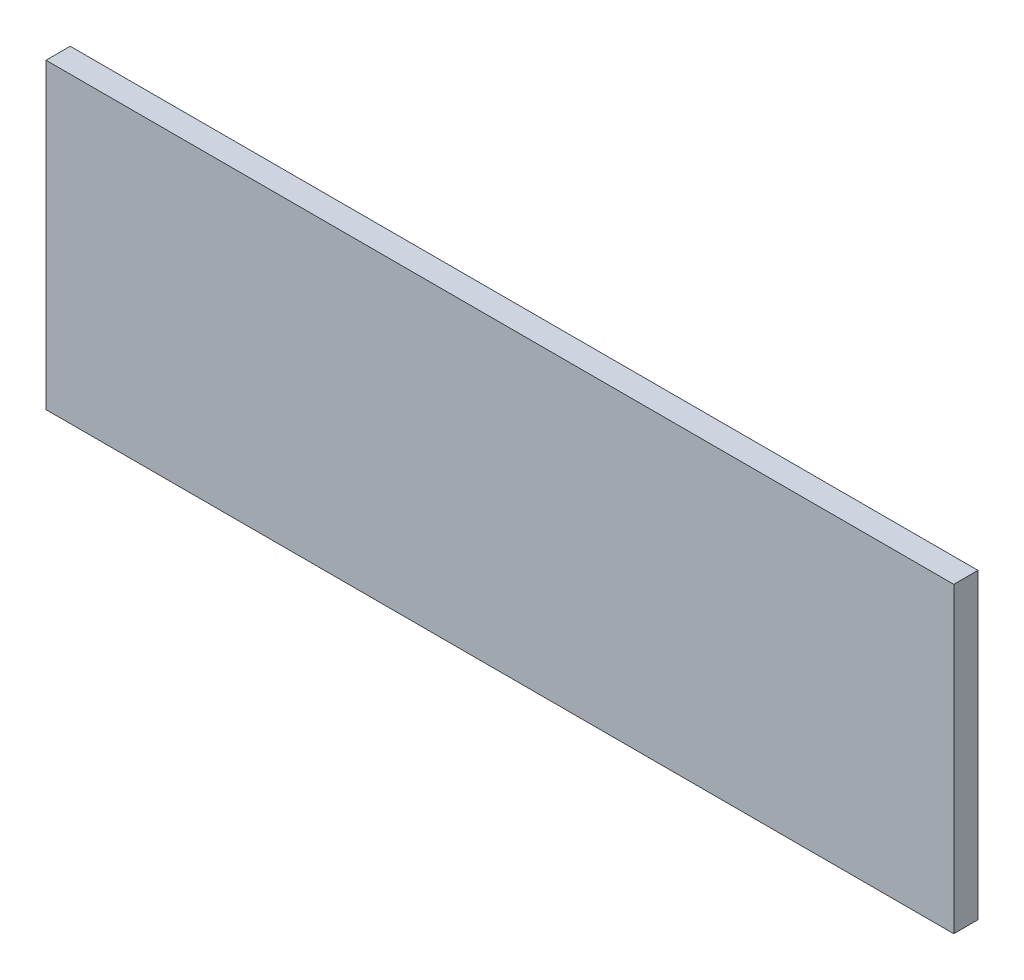
ISO-10303-21;
HEADER;
FILE_DESCRIPTION(('STEP AP214'),'2;1');
FILE_NAME('part.step','',(''),(''),'','','');
FILE_SCHEMA(('AUTOMOTIVE_DESIGN { 1 0 10303 214 1 1 1 1 }'));
ENDSEC;
DATA;
#1=APPLICATION_CONTEXT('core data for automotive mechanical design processes');
#2=APPLICATION_PROTOCOL_DEFINITION('international standard','automotive_design',2000,#1);
#3=PRODUCT_CONTEXT('',#1,'mechanical');
#4=PRODUCT('Part','Part','',(#3));
#5=PRODUCT_RELATED_PRODUCT_CATEGORY('part','',(#4));
#6=PRODUCT_DEFINITION_FORMATION('','',#4);
#7=PRODUCT_DEFINITION_CONTEXT('part definition',#1,'design');
#8=PRODUCT_DEFINITION('design','',#6,#7);
#9=PRODUCT_DEFINITION_SHAPE('','',#8);
#10=(LENGTH_UNIT() NAMED_UNIT(*) SI_UNIT(.MILLI.,.METRE.));
#11=(NAMED_UNIT(*) PLANE_ANGLE_UNIT() SI_UNIT($,.RADIAN.));
#12=(NAMED_UNIT(*) SI_UNIT($,.STERADIAN.) SOLID_ANGLE_UNIT());
#13=UNCERTAINTY_MEASURE_WITH_UNIT(LENGTH_MEASURE(1.E-05),#10,'distance_accuracy_value','');
#14=(GEOMETRIC_REPRESENTATION_CONTEXT(3) GLOBAL_UNCERTAINTY_ASSIGNED_CONTEXT((#13)) GLOBAL_UNIT_ASSIGNED_CONTEXT((#10,
#11,#12)) REPRESENTATION_CONTEXT('',''));
#15=CARTESIAN_POINT('',(0.,0.,0.));
#16=DIRECTION('',(0.,0.,1.));
#17=DIRECTION('',(1.,0.,0.));
#18=AXIS2_PLACEMENT_3D('',#15,#16,#17);
#19=CARTESIAN_POINT('',(75.,-25.,-2.));
#20=DIRECTION('',(0.,0.,1.));
#21=DIRECTION('',(1.,0.,0.));
#22=AXIS2_PLACEMENT_3D('',#19,#20,#21);
#23=PLANE('',#22);
#24=DIRECTION('',(0.,1.,0.));
#25=VECTOR('',#24,1.);
#26=CARTESIAN_POINT('',(-75.,-25.,-2.));
#27=LINE('',#26,#25);
#28=CARTESIAN_POINT('',(-75.,-25.,-2.));
#29=VERTEX_POINT('',#28);
#30=CARTESIAN_POINT('',(-75.,25.,-2.));
#31=VERTEX_POINT('',#30);
#32=EDGE_CURVE('E112',#29,#31,#27,.T.);
#33=ORIENTED_EDGE('',*,*,#32,.T.);
#34=DIRECTION('',(-1.,0.,0.));
#35=VECTOR('',#34,1.);
#36=CARTESIAN_POINT('',(75.,25.,-2.));
#37=LINE('',#36,#35);
#38=CARTESIAN_POINT('',(75.,25.,-2.));
#39=VERTEX_POINT('',#38);
#40=EDGE_CURVE('E11',#39,#31,#37,.T.);
#41=ORIENTED_EDGE('',*,*,#40,.F.);
#42=DIRECTION('',(0.,1.,0.));
#43=VECTOR('',#42,1.);
#44=CARTESIAN_POINT('',(75.,-25.,-2.));
#45=LINE('',#44,#43);
#46=CARTESIAN_POINT('',(75.,-25.,-2.));
#47=VERTEX_POINT('',#46);
#48=EDGE_CURVE('E97',#47,#39,#45,.T.);
#49=ORIENTED_EDGE('',*,*,#48,.F.);
#50=DIRECTION('',(-1.,0.,0.));
#51=VECTOR('',#50,1.);
#52=CARTESIAN_POINT('',(75.,-25.,-2.));
#53=LINE('',#52,#51);
#54=EDGE_CURVE('E108',#47,#29,#53,.T.);
#55=ORIENTED_EDGE('',*,*,#54,.T.);
#56=EDGE_LOOP('',(#33,#41,#49,#55));
#57=FACE_BOUND('',#56,.T.);
#58=ADVANCED_FACE('F39',(#57),#23,.F.);
#59=CARTESIAN_POINT('',(75.,25.,2.));
#60=DIRECTION('',(0.,-1.,0.));
#61=DIRECTION('',(0.,0.,-1.));
#62=AXIS2_PLACEMENT_3D('',#59,#60,#61);
#63=PLANE('',#62);
#64=DIRECTION('',(0.,0.,1.));
#65=VECTOR('',#64,1.);
#66=CARTESIAN_POINT('',(-75.,25.,2.));
#67=LINE('',#66,#65);
#68=CARTESIAN_POINT('',(-75.,25.,2.));
#69=VERTEX_POINT('',#68);
#70=EDGE_CURVE('E102',#31,#69,#67,.T.);
#71=ORIENTED_EDGE('',*,*,#70,.T.);
#72=DIRECTION('',(-1.,0.,0.));
#73=VECTOR('',#72,1.);
#74=CARTESIAN_POINT('',(75.,25.,2.));
#75=LINE('',#74,#73);
#76=CARTESIAN_POINT('',(75.,25.,2.));
#77=VERTEX_POINT('',#76);
#78=EDGE_CURVE('E48',#77,#69,#75,.T.);
#79=ORIENTED_EDGE('',*,*,#78,.F.);
#80=DIRECTION('',(0.,0.,1.));
#81=VECTOR('',#80,1.);
#82=CARTESIAN_POINT('',(75.,25.,2.));
#83=LINE('',#82,#81);
#84=EDGE_CURVE('E92',#39,#77,#83,.T.);
#85=ORIENTED_EDGE('',*,*,#84,.F.);
#86=ORIENTED_EDGE('',*,*,#40,.T.);
#87=EDGE_LOOP('',(#71,#79,#85,#86));
#88=FACE_BOUND('',#87,.T.);
#89=ADVANCED_FACE('F101',(#88),#63,.F.);
#90=CARTESIAN_POINT('',(75.,-25.,2.));
#91=DIRECTION('',(0.,0.,-1.));
#92=DIRECTION('',(-1.,0.,0.));
#93=AXIS2_PLACEMENT_3D('',#90,#91,#92);
#94=PLANE('',#93);
#95=DIRECTION('',(0.,-1.,0.));
#96=VECTOR('',#95,1.);
#97=CARTESIAN_POINT('',(-75.,-25.,2.));
#98=LINE('',#97,#96);
#99=CARTESIAN_POINT('',(-75.,-25.,2.));
#100=VERTEX_POINT('',#99);
#101=EDGE_CURVE('E78',#69,#100,#98,.T.);
#102=ORIENTED_EDGE('',*,*,#101,.T.);
#103=DIRECTION('',(-1.,0.,0.));
#104=VECTOR('',#103,1.);
#105=CARTESIAN_POINT('',(75.,-25.,2.));
#106=LINE('',#105,#104);
#107=CARTESIAN_POINT('',(75.,-25.,2.));
#108=VERTEX_POINT('',#107);
#109=EDGE_CURVE('E104',#108,#100,#106,.T.);
#110=ORIENTED_EDGE('',*,*,#109,.F.);
#111=DIRECTION('',(0.,-1.,0.));
#112=VECTOR('',#111,1.);
#113=CARTESIAN_POINT('',(75.,-25.,2.));
#114=LINE('',#113,#112);
#115=EDGE_CURVE('E95',#77,#108,#114,.T.);
#116=ORIENTED_EDGE('',*,*,#115,.F.);
#117=ORIENTED_EDGE('',*,*,#78,.T.);
#118=EDGE_LOOP('',(#102,#110,#116,#117));
#119=FACE_BOUND('',#118,.T.);
#120=ADVANCED_FACE('F105',(#119),#94,.F.);
#121=CARTESIAN_POINT('',(75.,-25.,2.));
#122=DIRECTION('',(0.,1.,0.));
#123=DIRECTION('',(0.,0.,1.));
#124=AXIS2_PLACEMENT_3D('',#121,#122,#123);
#125=PLANE('',#124);
#126=DIRECTION('',(0.,0.,-1.));
#127=VECTOR('',#126,1.);
#128=CARTESIAN_POINT('',(-75.,-25.,2.));
#129=LINE('',#128,#127);
#130=EDGE_CURVE('E84',#100,#29,#129,.T.);
#131=ORIENTED_EDGE('',*,*,#130,.T.);
#132=ORIENTED_EDGE('',*,*,#54,.F.);
#133=DIRECTION('',(0.,0.,-1.));
#134=VECTOR('',#133,1.);
#135=CARTESIAN_POINT('',(75.,-25.,2.));
#136=LINE('',#135,#134);
#137=EDGE_CURVE('E56',#108,#47,#136,.T.);
#138=ORIENTED_EDGE('',*,*,#137,.F.);
#139=ORIENTED_EDGE('',*,*,#109,.T.);
#140=EDGE_LOOP('',(#131,#132,#138,#139));
#141=FACE_BOUND('',#140,.T.);
#142=ADVANCED_FACE('F125',(#141),#125,.F.);
#143=CARTESIAN_POINT('',(75.,0.,0.));
#144=DIRECTION('',(-1.,0.,0.));
#145=DIRECTION('',(0.,0.,1.));
#146=AXIS2_PLACEMENT_3D('',#143,#144,#145);
#147=PLANE('',#146);
#148=ORIENTED_EDGE('',*,*,#48,.T.);
#149=ORIENTED_EDGE('',*,*,#84,.T.);
#150=ORIENTED_EDGE('',*,*,#115,.T.);
#151=ORIENTED_EDGE('',*,*,#137,.T.);
#152=EDGE_LOOP('',(#148,#149,#150,#151));
#153=FACE_BOUND('',#152,.T.);
#154=ADVANCED_FACE('F93',(#153),#147,.F.);
#155=CARTESIAN_POINT('',(-75.,0.,0.));
#156=DIRECTION('',(-1.,0.,0.));
#157=DIRECTION('',(0.,0.,1.));
#158=AXIS2_PLACEMENT_3D('',#155,#156,#157);
#159=PLANE('',#158);
#160=ORIENTED_EDGE('',*,*,#32,.F.);
#161=ORIENTED_EDGE('',*,*,#130,.F.);
#162=ORIENTED_EDGE('',*,*,#101,.F.);
#163=ORIENTED_EDGE('',*,*,#70,.F.);
#164=EDGE_LOOP('',(#160,#161,#162,#163));
#165=FACE_BOUND('',#164,.T.);
#166=ADVANCED_FACE('F128',(#165),#159,.T.);
#167=CLOSED_SHELL('',(#58,#89,#120,#142,#154,#166));
#168=MANIFOLD_SOLID_BREP('B2',#167);
#169=ADVANCED_BREP_SHAPE_REPRESENTATION('',(#18,#168),#14);
#170=SHAPE_DEFINITION_REPRESENTATION(#9,#169);
ENDSEC;
END-ISO-10303-21;
